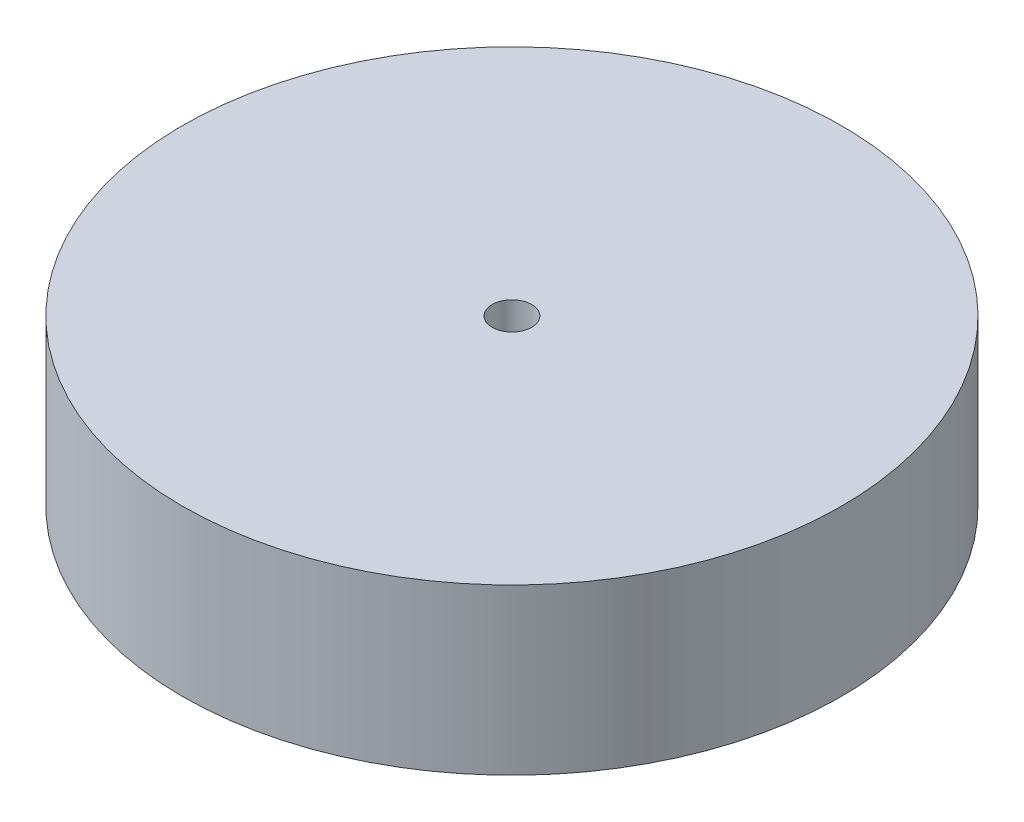
ISO-10303-21;
HEADER;
FILE_DESCRIPTION(('STEP AP214'),'2;1');
FILE_NAME('part.step','',(''),(''),'','','');
FILE_SCHEMA(('AUTOMOTIVE_DESIGN { 1 0 10303 214 1 1 1 1 }'));
ENDSEC;
DATA;
#1=APPLICATION_CONTEXT('core data for automotive mechanical design processes');
#2=APPLICATION_PROTOCOL_DEFINITION('international standard','automotive_design',2000,#1);
#3=PRODUCT_CONTEXT('',#1,'mechanical');
#4=PRODUCT('Part','Part','',(#3));
#5=PRODUCT_RELATED_PRODUCT_CATEGORY('part','',(#4));
#6=PRODUCT_DEFINITION_FORMATION('','',#4);
#7=PRODUCT_DEFINITION_CONTEXT('part definition',#1,'design');
#8=PRODUCT_DEFINITION('design','',#6,#7);
#9=PRODUCT_DEFINITION_SHAPE('','',#8);
#10=(LENGTH_UNIT() NAMED_UNIT(*) SI_UNIT(.MILLI.,.METRE.));
#11=(NAMED_UNIT(*) PLANE_ANGLE_UNIT() SI_UNIT($,.RADIAN.));
#12=(NAMED_UNIT(*) SI_UNIT($,.STERADIAN.) SOLID_ANGLE_UNIT());
#13=UNCERTAINTY_MEASURE_WITH_UNIT(LENGTH_MEASURE(1.E-05),#10,'distance_accuracy_value','');
#14=(GEOMETRIC_REPRESENTATION_CONTEXT(3) GLOBAL_UNCERTAINTY_ASSIGNED_CONTEXT((#13)) GLOBAL_UNIT_ASSIGNED_CONTEXT((#10,
#11,#12)) REPRESENTATION_CONTEXT('',''));
#15=CARTESIAN_POINT('',(0.,0.,0.));
#16=DIRECTION('',(0.,0.,1.));
#17=DIRECTION('',(1.,0.,0.));
#18=AXIS2_PLACEMENT_3D('',#15,#16,#17);
#19=CARTESIAN_POINT('',(0.,25.,0.));
#20=DIRECTION('',(0.,1.,0.));
#21=DIRECTION('',(0.,0.,1.));
#22=AXIS2_PLACEMENT_3D('',#19,#20,#21);
#23=PLANE('',#22);
#24=CARTESIAN_POINT('',(0.,25.,0.));
#25=DIRECTION('',(0.,1.,0.));
#26=DIRECTION('',(0.,0.,1.));
#27=AXIS2_PLACEMENT_3D('',#24,#25,#26);
#28=CIRCLE('',#27,50.);
#29=CARTESIAN_POINT('',(0.,25.,50.));
#30=VERTEX_POINT('',#29);
#31=EDGE_CURVE('E10',#30,#30,#28,.T.);
#32=ORIENTED_EDGE('',*,*,#31,.T.);
#33=EDGE_LOOP('',(#32));
#34=FACE_BOUND('',#33,.T.);
#35=CARTESIAN_POINT('',(0.,25.,0.));
#36=DIRECTION('',(0.,1.,0.));
#37=DIRECTION('',(0.,0.,1.));
#38=AXIS2_PLACEMENT_3D('',#35,#36,#37);
#39=CIRCLE('',#38,3.);
#40=CARTESIAN_POINT('',(0.,25.,3.));
#41=VERTEX_POINT('',#40);
#42=EDGE_CURVE('E54',#41,#41,#39,.T.);
#43=ORIENTED_EDGE('',*,*,#42,.F.);
#44=EDGE_LOOP('',(#43));
#45=FACE_BOUND('',#44,.T.);
#46=ADVANCED_FACE('F41',(#34,#45),#23,.T.);
#47=CARTESIAN_POINT('',(0.,0.,0.));
#48=DIRECTION('',(0.,1.,0.));
#49=DIRECTION('',(0.,0.,1.));
#50=AXIS2_PLACEMENT_3D('',#47,#48,#49);
#51=PLANE('',#50);
#52=CARTESIAN_POINT('',(0.,0.,0.));
#53=DIRECTION('',(0.,1.,0.));
#54=DIRECTION('',(0.,0.,1.));
#55=AXIS2_PLACEMENT_3D('',#52,#53,#54);
#56=CIRCLE('',#55,50.);
#57=CARTESIAN_POINT('',(0.,0.,50.));
#58=VERTEX_POINT('',#57);
#59=EDGE_CURVE('E45',#58,#58,#56,.T.);
#60=ORIENTED_EDGE('',*,*,#59,.F.);
#61=EDGE_LOOP('',(#60));
#62=FACE_BOUND('',#61,.T.);
#63=CARTESIAN_POINT('',(0.,0.,0.));
#64=DIRECTION('',(0.,1.,0.));
#65=DIRECTION('',(0.,0.,1.));
#66=AXIS2_PLACEMENT_3D('',#63,#64,#65);
#67=CIRCLE('',#66,3.);
#68=CARTESIAN_POINT('',(0.,0.,3.));
#69=VERTEX_POINT('',#68);
#70=EDGE_CURVE('E56',#69,#69,#67,.T.);
#71=ORIENTED_EDGE('',*,*,#70,.T.);
#72=EDGE_LOOP('',(#71));
#73=FACE_BOUND('',#72,.T.);
#74=ADVANCED_FACE('F68',(#62,#73),#51,.F.);
#75=CARTESIAN_POINT('',(0.,25.,0.));
#76=DIRECTION('',(0.,-1.,0.));
#77=DIRECTION('',(0.,0.,-1.));
#78=AXIS2_PLACEMENT_3D('',#75,#76,#77);
#79=CYLINDRICAL_SURFACE('',#78,50.);
#80=ORIENTED_EDGE('',*,*,#31,.F.);
#81=EDGE_LOOP('',(#80));
#82=FACE_BOUND('',#81,.T.);
#83=ORIENTED_EDGE('',*,*,#59,.T.);
#84=EDGE_LOOP('',(#83));
#85=FACE_BOUND('',#84,.T.);
#86=ADVANCED_FACE('F43',(#82,#85),#79,.T.);
#87=CARTESIAN_POINT('',(0.,25.,0.));
#88=DIRECTION('',(0.,-1.,0.));
#89=DIRECTION('',(0.,0.,-1.));
#90=AXIS2_PLACEMENT_3D('',#87,#88,#89);
#91=CYLINDRICAL_SURFACE('',#90,3.);
#92=ORIENTED_EDGE('',*,*,#42,.T.);
#93=EDGE_LOOP('',(#92));
#94=FACE_BOUND('',#93,.T.);
#95=ORIENTED_EDGE('',*,*,#70,.F.);
#96=EDGE_LOOP('',(#95));
#97=FACE_BOUND('',#96,.T.);
#98=ADVANCED_FACE('F64',(#94,#97),#91,.F.);
#99=CLOSED_SHELL('',(#46,#74,#86,#98));
#100=MANIFOLD_SOLID_BREP('B2',#99);
#101=ADVANCED_BREP_SHAPE_REPRESENTATION('',(#18,#100),#14);
#102=SHAPE_DEFINITION_REPRESENTATION(#9,#101);
ENDSEC;
END-ISO-10303-21;
